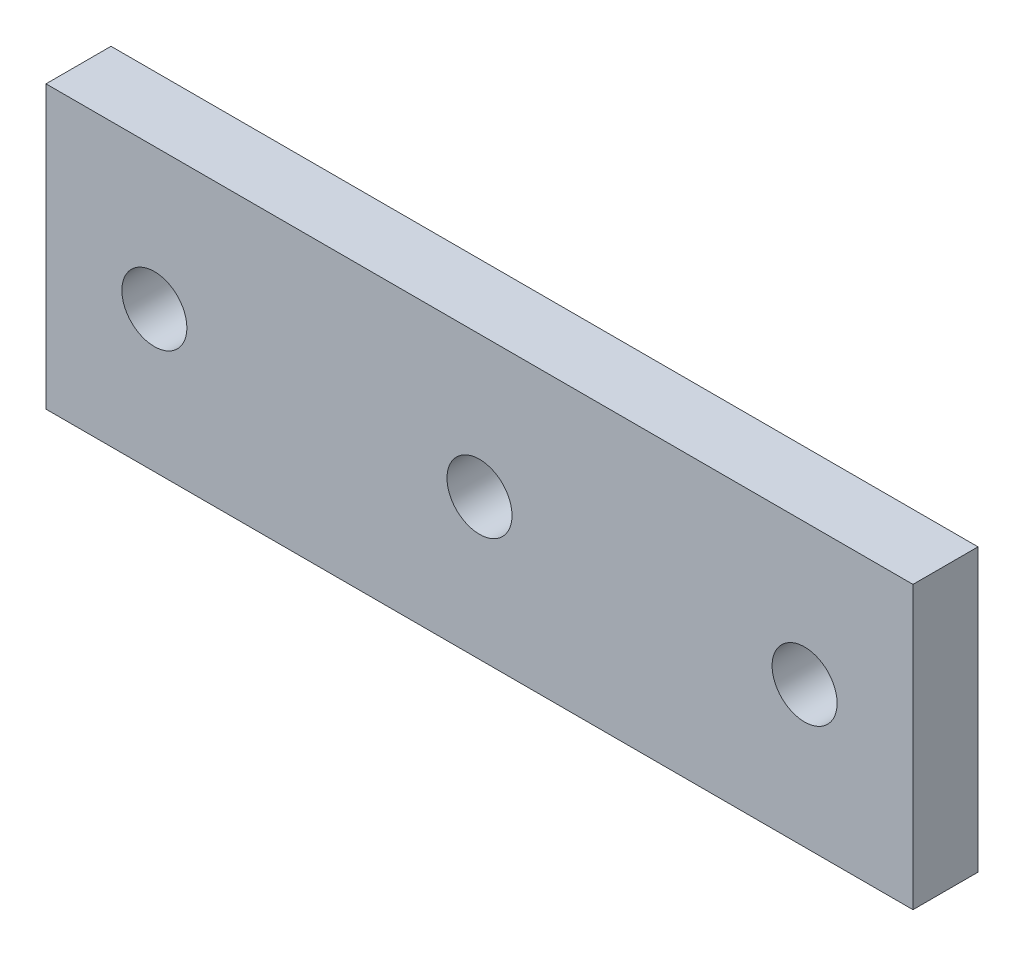
ISO-10303-21;
HEADER;
FILE_DESCRIPTION(('STEP AP214'),'2;1');
FILE_NAME('part.step','',(''),(''),'','','');
FILE_SCHEMA(('AUTOMOTIVE_DESIGN { 1 0 10303 214 1 1 1 1 }'));
ENDSEC;
DATA;
#1=APPLICATION_CONTEXT('core data for automotive mechanical design processes');
#2=APPLICATION_PROTOCOL_DEFINITION('international standard','automotive_design',2000,#1);
#3=PRODUCT_CONTEXT('',#1,'mechanical');
#4=PRODUCT('Part','Part','',(#3));
#5=PRODUCT_RELATED_PRODUCT_CATEGORY('part','',(#4));
#6=PRODUCT_DEFINITION_FORMATION('','',#4);
#7=PRODUCT_DEFINITION_CONTEXT('part definition',#1,'design');
#8=PRODUCT_DEFINITION('design','',#6,#7);
#9=PRODUCT_DEFINITION_SHAPE('','',#8);
#10=(LENGTH_UNIT() NAMED_UNIT(*) SI_UNIT(.MILLI.,.METRE.));
#11=(NAMED_UNIT(*) PLANE_ANGLE_UNIT() SI_UNIT($,.RADIAN.));
#12=(NAMED_UNIT(*) SI_UNIT($,.STERADIAN.) SOLID_ANGLE_UNIT());
#13=UNCERTAINTY_MEASURE_WITH_UNIT(LENGTH_MEASURE(1.E-05),#10,'distance_accuracy_value','');
#14=(GEOMETRIC_REPRESENTATION_CONTEXT(3) GLOBAL_UNCERTAINTY_ASSIGNED_CONTEXT((#13)) GLOBAL_UNIT_ASSIGNED_CONTEXT((#10,
#11,#12)) REPRESENTATION_CONTEXT('',''));
#15=CARTESIAN_POINT('',(0.,0.,0.));
#16=DIRECTION('',(0.,0.,1.));
#17=DIRECTION('',(1.,0.,0.));
#18=AXIS2_PLACEMENT_3D('',#15,#16,#17);
#19=CARTESIAN_POINT('',(0.,0.,3.));
#20=DIRECTION('',(0.,0.,-1.));
#21=DIRECTION('',(-1.,0.,0.));
#22=AXIS2_PLACEMENT_3D('',#19,#20,#21);
#23=PLANE('',#22);
#24=DIRECTION('',(0.,1.,0.));
#25=VECTOR('',#24,1.);
#26=CARTESIAN_POINT('',(20.,-6.5,3.));
#27=LINE('',#26,#25);
#28=CARTESIAN_POINT('',(20.,-6.5,3.));
#29=VERTEX_POINT('',#28);
#30=CARTESIAN_POINT('',(20.,6.5,3.));
#31=VERTEX_POINT('',#30);
#32=EDGE_CURVE('E92',#29,#31,#27,.T.);
#33=ORIENTED_EDGE('',*,*,#32,.T.);
#34=DIRECTION('',(-1.,0.,0.));
#35=VECTOR('',#34,1.);
#36=CARTESIAN_POINT('',(-20.,6.5,3.));
#37=LINE('',#36,#35);
#38=CARTESIAN_POINT('',(-20.,6.5,3.));
#39=VERTEX_POINT('',#38);
#40=EDGE_CURVE('E87',#31,#39,#37,.T.);
#41=ORIENTED_EDGE('',*,*,#40,.T.);
#42=DIRECTION('',(0.,-1.,0.));
#43=VECTOR('',#42,1.);
#44=CARTESIAN_POINT('',(-20.,-6.5,3.));
#45=LINE('',#44,#43);
#46=CARTESIAN_POINT('',(-20.,-6.5,3.));
#47=VERTEX_POINT('',#46);
#48=EDGE_CURVE('E90',#39,#47,#45,.T.);
#49=ORIENTED_EDGE('',*,*,#48,.T.);
#50=DIRECTION('',(1.,0.,0.));
#51=VECTOR('',#50,1.);
#52=CARTESIAN_POINT('',(-20.,-6.5,3.));
#53=LINE('',#52,#51);
#54=EDGE_CURVE('E57',#47,#29,#53,.T.);
#55=ORIENTED_EDGE('',*,*,#54,.T.);
#56=EDGE_LOOP('',(#33,#41,#49,#55));
#57=FACE_BOUND('',#56,.T.);
#58=CARTESIAN_POINT('',(0.,0.,3.));
#59=DIRECTION('',(0.,0.,1.));
#60=DIRECTION('',(1.,0.,0.));
#61=AXIS2_PLACEMENT_3D('',#58,#59,#60);
#62=CIRCLE('',#61,1.5);
#63=CARTESIAN_POINT('',(1.5,0.,3.));
#64=VERTEX_POINT('',#63);
#65=EDGE_CURVE('E112',#64,#64,#62,.T.);
#66=ORIENTED_EDGE('',*,*,#65,.F.);
#67=EDGE_LOOP('',(#66));
#68=FACE_BOUND('',#67,.T.);
#69=CARTESIAN_POINT('',(-15.,0.,3.));
#70=DIRECTION('',(0.,0.,1.));
#71=DIRECTION('',(1.,0.,0.));
#72=AXIS2_PLACEMENT_3D('',#69,#70,#71);
#73=CIRCLE('',#72,1.5);
#74=CARTESIAN_POINT('',(-13.5,0.,3.));
#75=VERTEX_POINT('',#74);
#76=EDGE_CURVE('E134',#75,#75,#73,.T.);
#77=ORIENTED_EDGE('',*,*,#76,.F.);
#78=EDGE_LOOP('',(#77));
#79=FACE_BOUND('',#78,.T.);
#80=CARTESIAN_POINT('',(15.,0.,3.));
#81=DIRECTION('',(0.,0.,1.));
#82=DIRECTION('',(1.,0.,0.));
#83=AXIS2_PLACEMENT_3D('',#80,#81,#82);
#84=CIRCLE('',#83,1.5);
#85=CARTESIAN_POINT('',(16.5,0.,3.));
#86=VERTEX_POINT('',#85);
#87=EDGE_CURVE('E142',#86,#86,#84,.T.);
#88=ORIENTED_EDGE('',*,*,#87,.F.);
#89=EDGE_LOOP('',(#88));
#90=FACE_BOUND('',#89,.T.);
#91=ADVANCED_FACE('F39',(#57,#68,#79,#90),#23,.F.);
#92=CARTESIAN_POINT('',(0.,0.,0.));
#93=DIRECTION('',(0.,0.,-1.));
#94=DIRECTION('',(-1.,0.,0.));
#95=AXIS2_PLACEMENT_3D('',#92,#93,#94);
#96=PLANE('',#95);
#97=CARTESIAN_POINT('',(-15.,0.,0.));
#98=DIRECTION('',(0.,0.,1.));
#99=DIRECTION('',(1.,0.,0.));
#100=AXIS2_PLACEMENT_3D('',#97,#98,#99);
#101=CIRCLE('',#100,1.5);
#102=CARTESIAN_POINT('',(-13.5,0.,0.));
#103=VERTEX_POINT('',#102);
#104=EDGE_CURVE('E138',#103,#103,#101,.T.);
#105=ORIENTED_EDGE('',*,*,#104,.T.);
#106=EDGE_LOOP('',(#105));
#107=FACE_BOUND('',#106,.T.);
#108=DIRECTION('',(0.,1.,0.));
#109=VECTOR('',#108,1.);
#110=CARTESIAN_POINT('',(20.,-6.5,0.));
#111=LINE('',#110,#109);
#112=CARTESIAN_POINT('',(20.,-6.5,0.));
#113=VERTEX_POINT('',#112);
#114=CARTESIAN_POINT('',(20.,6.5,0.));
#115=VERTEX_POINT('',#114);
#116=EDGE_CURVE('E108',#113,#115,#111,.T.);
#117=ORIENTED_EDGE('',*,*,#116,.F.);
#118=DIRECTION('',(1.,0.,0.));
#119=VECTOR('',#118,1.);
#120=CARTESIAN_POINT('',(-20.,-6.5,0.));
#121=LINE('',#120,#119);
#122=CARTESIAN_POINT('',(-20.,-6.5,0.));
#123=VERTEX_POINT('',#122);
#124=EDGE_CURVE('E80',#123,#113,#121,.T.);
#125=ORIENTED_EDGE('',*,*,#124,.F.);
#126=DIRECTION('',(0.,-1.,0.));
#127=VECTOR('',#126,1.);
#128=CARTESIAN_POINT('',(-20.,-6.5,0.));
#129=LINE('',#128,#127);
#130=CARTESIAN_POINT('',(-20.,6.5,0.));
#131=VERTEX_POINT('',#130);
#132=EDGE_CURVE('E74',#131,#123,#129,.T.);
#133=ORIENTED_EDGE('',*,*,#132,.F.);
#134=DIRECTION('',(-1.,0.,0.));
#135=VECTOR('',#134,1.);
#136=CARTESIAN_POINT('',(-20.,6.5,0.));
#137=LINE('',#136,#135);
#138=EDGE_CURVE('E97',#115,#131,#137,.T.);
#139=ORIENTED_EDGE('',*,*,#138,.F.);
#140=EDGE_LOOP('',(#117,#125,#133,#139));
#141=FACE_BOUND('',#140,.T.);
#142=CARTESIAN_POINT('',(0.,0.,0.));
#143=DIRECTION('',(0.,0.,1.));
#144=DIRECTION('',(1.,0.,0.));
#145=AXIS2_PLACEMENT_3D('',#142,#143,#144);
#146=CIRCLE('',#145,1.5);
#147=CARTESIAN_POINT('',(1.5,0.,0.));
#148=VERTEX_POINT('',#147);
#149=EDGE_CURVE('E130',#148,#148,#146,.T.);
#150=ORIENTED_EDGE('',*,*,#149,.T.);
#151=EDGE_LOOP('',(#150));
#152=FACE_BOUND('',#151,.T.);
#153=CARTESIAN_POINT('',(15.,0.,0.));
#154=DIRECTION('',(0.,0.,1.));
#155=DIRECTION('',(1.,0.,0.));
#156=AXIS2_PLACEMENT_3D('',#153,#154,#155);
#157=CIRCLE('',#156,1.5);
#158=CARTESIAN_POINT('',(16.5,0.,0.));
#159=VERTEX_POINT('',#158);
#160=EDGE_CURVE('E146',#159,#159,#157,.T.);
#161=ORIENTED_EDGE('',*,*,#160,.T.);
#162=EDGE_LOOP('',(#161));
#163=FACE_BOUND('',#162,.T.);
#164=ADVANCED_FACE('F125',(#107,#141,#152,#163),#96,.T.);
#165=CARTESIAN_POINT('',(20.,-6.5,3.));
#166=DIRECTION('',(-1.,0.,0.));
#167=DIRECTION('',(0.,0.,1.));
#168=AXIS2_PLACEMENT_3D('',#165,#166,#167);
#169=PLANE('',#168);
#170=ORIENTED_EDGE('',*,*,#116,.T.);
#171=DIRECTION('',(0.,0.,-1.));
#172=VECTOR('',#171,1.);
#173=CARTESIAN_POINT('',(20.,6.5,3.));
#174=LINE('',#173,#172);
#175=EDGE_CURVE('E11',#31,#115,#174,.T.);
#176=ORIENTED_EDGE('',*,*,#175,.F.);
#177=ORIENTED_EDGE('',*,*,#32,.F.);
#178=DIRECTION('',(0.,0.,-1.));
#179=VECTOR('',#178,1.);
#180=CARTESIAN_POINT('',(20.,-6.5,3.));
#181=LINE('',#180,#179);
#182=EDGE_CURVE('E104',#29,#113,#181,.T.);
#183=ORIENTED_EDGE('',*,*,#182,.T.);
#184=EDGE_LOOP('',(#170,#176,#177,#183));
#185=FACE_BOUND('',#184,.T.);
#186=ADVANCED_FACE('F41',(#185),#169,.F.);
#187=CARTESIAN_POINT('',(-20.,6.5,3.));
#188=DIRECTION('',(0.,-1.,0.));
#189=DIRECTION('',(0.,0.,-1.));
#190=AXIS2_PLACEMENT_3D('',#187,#188,#189);
#191=PLANE('',#190);
#192=ORIENTED_EDGE('',*,*,#138,.T.);
#193=DIRECTION('',(0.,0.,-1.));
#194=VECTOR('',#193,1.);
#195=CARTESIAN_POINT('',(-20.,6.5,3.));
#196=LINE('',#195,#194);
#197=EDGE_CURVE('E49',#39,#131,#196,.T.);
#198=ORIENTED_EDGE('',*,*,#197,.F.);
#199=ORIENTED_EDGE('',*,*,#40,.F.);
#200=ORIENTED_EDGE('',*,*,#175,.T.);
#201=EDGE_LOOP('',(#192,#198,#199,#200));
#202=FACE_BOUND('',#201,.T.);
#203=ADVANCED_FACE('F96',(#202),#191,.F.);
#204=CARTESIAN_POINT('',(-20.,-6.5,3.));
#205=DIRECTION('',(1.,0.,0.));
#206=DIRECTION('',(0.,0.,-1.));
#207=AXIS2_PLACEMENT_3D('',#204,#205,#206);
#208=PLANE('',#207);
#209=ORIENTED_EDGE('',*,*,#132,.T.);
#210=DIRECTION('',(0.,0.,-1.));
#211=VECTOR('',#210,1.);
#212=CARTESIAN_POINT('',(-20.,-6.5,3.));
#213=LINE('',#212,#211);
#214=EDGE_CURVE('E99',#47,#123,#213,.T.);
#215=ORIENTED_EDGE('',*,*,#214,.F.);
#216=ORIENTED_EDGE('',*,*,#48,.F.);
#217=ORIENTED_EDGE('',*,*,#197,.T.);
#218=EDGE_LOOP('',(#209,#215,#216,#217));
#219=FACE_BOUND('',#218,.T.);
#220=ADVANCED_FACE('F100',(#219),#208,.F.);
#221=CARTESIAN_POINT('',(-20.,-6.5,3.));
#222=DIRECTION('',(0.,1.,0.));
#223=DIRECTION('',(0.,0.,1.));
#224=AXIS2_PLACEMENT_3D('',#221,#222,#223);
#225=PLANE('',#224);
#226=ORIENTED_EDGE('',*,*,#124,.T.);
#227=ORIENTED_EDGE('',*,*,#182,.F.);
#228=ORIENTED_EDGE('',*,*,#54,.F.);
#229=ORIENTED_EDGE('',*,*,#214,.T.);
#230=EDGE_LOOP('',(#226,#227,#228,#229));
#231=FACE_BOUND('',#230,.T.);
#232=ADVANCED_FACE('F122',(#231),#225,.F.);
#233=CARTESIAN_POINT('',(0.,0.,3.));
#234=DIRECTION('',(0.,0.,-1.));
#235=DIRECTION('',(-1.,0.,0.));
#236=AXIS2_PLACEMENT_3D('',#233,#234,#235);
#237=CYLINDRICAL_SURFACE('',#236,1.5);
#238=ORIENTED_EDGE('',*,*,#65,.T.);
#239=EDGE_LOOP('',(#238));
#240=FACE_BOUND('',#239,.T.);
#241=ORIENTED_EDGE('',*,*,#149,.F.);
#242=EDGE_LOOP('',(#241));
#243=FACE_BOUND('',#242,.T.);
#244=ADVANCED_FACE('F165',(#240,#243),#237,.F.);
#245=CARTESIAN_POINT('',(-15.,0.,3.));
#246=DIRECTION('',(0.,0.,-1.));
#247=DIRECTION('',(-1.,0.,0.));
#248=AXIS2_PLACEMENT_3D('',#245,#246,#247);
#249=CYLINDRICAL_SURFACE('',#248,1.5);
#250=ORIENTED_EDGE('',*,*,#76,.T.);
#251=EDGE_LOOP('',(#250));
#252=FACE_BOUND('',#251,.T.);
#253=ORIENTED_EDGE('',*,*,#104,.F.);
#254=EDGE_LOOP('',(#253));
#255=FACE_BOUND('',#254,.T.);
#256=ADVANCED_FACE('F211',(#252,#255),#249,.F.);
#257=CARTESIAN_POINT('',(15.,0.,3.));
#258=DIRECTION('',(0.,0.,-1.));
#259=DIRECTION('',(-1.,0.,0.));
#260=AXIS2_PLACEMENT_3D('',#257,#258,#259);
#261=CYLINDRICAL_SURFACE('',#260,1.5);
#262=ORIENTED_EDGE('',*,*,#87,.T.);
#263=EDGE_LOOP('',(#262));
#264=FACE_BOUND('',#263,.T.);
#265=ORIENTED_EDGE('',*,*,#160,.F.);
#266=EDGE_LOOP('',(#265));
#267=FACE_BOUND('',#266,.T.);
#268=ADVANCED_FACE('F154',(#264,#267),#261,.F.);
#269=CLOSED_SHELL('',(#91,#164,#186,#203,#220,#232,#244,#256,#268));
#270=MANIFOLD_SOLID_BREP('B2',#269);
#271=ADVANCED_BREP_SHAPE_REPRESENTATION('',(#18,#270),#14);
#272=SHAPE_DEFINITION_REPRESENTATION(#9,#271);
ENDSEC;
END-ISO-10303-21;
